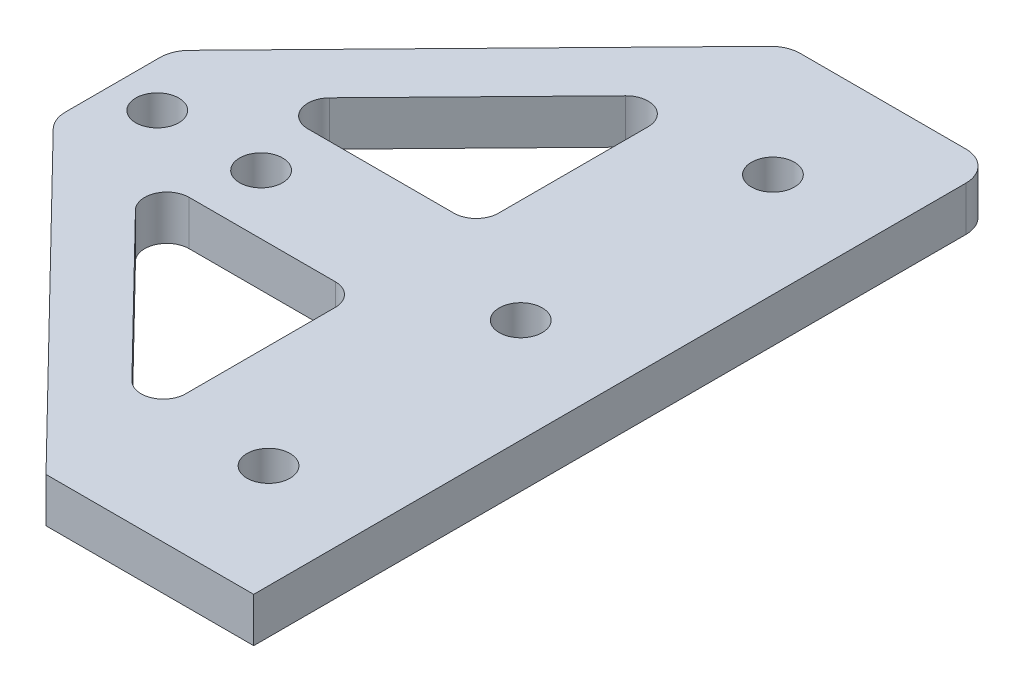
ISO-10303-21;
HEADER;
FILE_DESCRIPTION(('STEP AP214'),'2;1');
FILE_NAME('part.step','',(''),(''),'','','');
FILE_SCHEMA(('AUTOMOTIVE_DESIGN { 1 0 10303 214 1 1 1 1 }'));
ENDSEC;
DATA;
#1=APPLICATION_CONTEXT('core data for automotive mechanical design processes');
#2=APPLICATION_PROTOCOL_DEFINITION('international standard','automotive_design',2000,#1);
#3=PRODUCT_CONTEXT('',#1,'mechanical');
#4=PRODUCT('Part','Part','',(#3));
#5=PRODUCT_RELATED_PRODUCT_CATEGORY('part','',(#4));
#6=PRODUCT_DEFINITION_FORMATION('','',#4);
#7=PRODUCT_DEFINITION_CONTEXT('part definition',#1,'design');
#8=PRODUCT_DEFINITION('design','',#6,#7);
#9=PRODUCT_DEFINITION_SHAPE('','',#8);
#10=(LENGTH_UNIT() NAMED_UNIT(*) SI_UNIT(.MILLI.,.METRE.));
#11=(NAMED_UNIT(*) PLANE_ANGLE_UNIT() SI_UNIT($,.RADIAN.));
#12=(NAMED_UNIT(*) SI_UNIT($,.STERADIAN.) SOLID_ANGLE_UNIT());
#13=UNCERTAINTY_MEASURE_WITH_UNIT(LENGTH_MEASURE(1.E-05),#10,'distance_accuracy_value','');
#14=(GEOMETRIC_REPRESENTATION_CONTEXT(3) GLOBAL_UNCERTAINTY_ASSIGNED_CONTEXT((#13)) GLOBAL_UNIT_ASSIGNED_CONTEXT((#10,
#11,#12)) REPRESENTATION_CONTEXT('',''));
#15=CARTESIAN_POINT('',(0.,0.,0.));
#16=DIRECTION('',(0.,0.,1.));
#17=DIRECTION('',(1.,0.,0.));
#18=AXIS2_PLACEMENT_3D('',#15,#16,#17);
#19=CARTESIAN_POINT('',(0.,3.,0.));
#20=DIRECTION('',(-1.,0.,0.));
#21=DIRECTION('',(0.,0.,1.));
#22=AXIS2_PLACEMENT_3D('',#19,#20,#21);
#23=PLANE('',#22);
#24=DIRECTION('',(0.,0.,-1.));
#25=VECTOR('',#24,1.);
#26=CARTESIAN_POINT('',(0.,3.,0.));
#27=LINE('',#26,#25);
#28=CARTESIAN_POINT('',(0.,3.,-0.814347432356918));
#29=VERTEX_POINT('',#28);
#30=CARTESIAN_POINT('',(0.,3.,-7.18565256764308));
#31=VERTEX_POINT('',#30);
#32=EDGE_CURVE('E241',#29,#31,#27,.T.);
#33=ORIENTED_EDGE('',*,*,#32,.T.);
#34=DIRECTION('',(0.,-1.,0.));
#35=VECTOR('',#34,1.);
#36=CARTESIAN_POINT('',(0.,3.,-7.18565256764308));
#37=LINE('',#36,#35);
#38=CARTESIAN_POINT('',(0.,0.,-7.18565256764308));
#39=VERTEX_POINT('',#38);
#40=EDGE_CURVE('E53',#31,#39,#37,.T.);
#41=ORIENTED_EDGE('',*,*,#40,.T.);
#42=DIRECTION('',(0.,0.,-1.));
#43=VECTOR('',#42,1.);
#44=CARTESIAN_POINT('',(0.,0.,0.));
#45=LINE('',#44,#43);
#46=CARTESIAN_POINT('',(0.,0.,-0.814347432356918));
#47=VERTEX_POINT('',#46);
#48=EDGE_CURVE('E253',#47,#39,#45,.T.);
#49=ORIENTED_EDGE('',*,*,#48,.F.);
#50=DIRECTION('',(0.,-1.,0.));
#51=VECTOR('',#50,1.);
#52=CARTESIAN_POINT('',(0.,3.,-0.814347432356918));
#53=LINE('',#52,#51);
#54=EDGE_CURVE('E338',#47,#29,#53,.F.);
#55=ORIENTED_EDGE('',*,*,#54,.T.);
#56=EDGE_LOOP('',(#33,#41,#49,#55));
#57=FACE_BOUND('',#56,.T.);
#58=ADVANCED_FACE('F45',(#57),#23,.T.);
#59=CARTESIAN_POINT('',(0.,3.,0.));
#60=DIRECTION('',(0.,0.,-1.));
#61=DIRECTION('',(-1.,0.,0.));
#62=AXIS2_PLACEMENT_3D('',#59,#60,#61);
#63=PLANE('',#62);
#64=DIRECTION('',(1.,0.,0.));
#65=VECTOR('',#64,1.);
#66=CARTESIAN_POINT('',(0.,0.,0.));
#67=LINE('',#66,#65);
#68=CARTESIAN_POINT('',(9.15042078567245,0.,0.));
#69=VERTEX_POINT('',#68);
#70=CARTESIAN_POINT('',(19.,0.,0.));
#71=VERTEX_POINT('',#70);
#72=EDGE_CURVE('E255',#69,#71,#67,.T.);
#73=ORIENTED_EDGE('',*,*,#72,.T.);
#74=DIRECTION('',(0.,1.,0.));
#75=VECTOR('',#74,1.);
#76=CARTESIAN_POINT('',(19.,3.,0.));
#77=LINE('',#76,#75);
#78=CARTESIAN_POINT('',(19.,3.,0.));
#79=VERTEX_POINT('',#78);
#80=EDGE_CURVE('E276',#71,#79,#77,.T.);
#81=ORIENTED_EDGE('',*,*,#80,.T.);
#82=DIRECTION('',(1.,0.,0.));
#83=VECTOR('',#82,1.);
#84=CARTESIAN_POINT('',(0.,3.,0.));
#85=LINE('',#84,#83);
#86=CARTESIAN_POINT('',(9.15042078567245,3.,0.));
#87=VERTEX_POINT('',#86);
#88=EDGE_CURVE('E244',#87,#79,#85,.T.);
#89=ORIENTED_EDGE('',*,*,#88,.F.);
#90=DIRECTION('',(0.,1.,0.));
#91=VECTOR('',#90,1.);
#92=CARTESIAN_POINT('',(9.15042078567245,3.,0.));
#93=LINE('',#92,#91);
#94=EDGE_CURVE('E274',#87,#69,#93,.F.);
#95=ORIENTED_EDGE('',*,*,#94,.T.);
#96=EDGE_LOOP('',(#73,#81,#89,#95));
#97=FACE_BOUND('',#96,.T.);
#98=ADVANCED_FACE('F446',(#97),#63,.F.);
#99=CARTESIAN_POINT('',(10.,3.,-4.));
#100=DIRECTION('',(0.,-1.,0.));
#101=DIRECTION('',(0.,0.,-1.));
#102=AXIS2_PLACEMENT_3D('',#99,#100,#101);
#103=CYLINDRICAL_SURFACE('',#102,1.45);
#104=CARTESIAN_POINT('',(10.,3.,-4.));
#105=DIRECTION('',(0.,1.,0.));
#106=DIRECTION('',(0.,0.,1.));
#107=AXIS2_PLACEMENT_3D('',#104,#105,#106);
#108=CIRCLE('',#107,1.45);
#109=CARTESIAN_POINT('',(10.,3.,-2.55));
#110=VERTEX_POINT('',#109);
#111=EDGE_CURVE('E237',#110,#110,#108,.T.);
#112=ORIENTED_EDGE('',*,*,#111,.T.);
#113=EDGE_LOOP('',(#112));
#114=FACE_BOUND('',#113,.T.);
#115=CARTESIAN_POINT('',(10.,0.,-4.));
#116=DIRECTION('',(0.,1.,0.));
#117=DIRECTION('',(0.,0.,1.));
#118=AXIS2_PLACEMENT_3D('',#115,#116,#117);
#119=CIRCLE('',#118,1.45);
#120=CARTESIAN_POINT('',(10.,0.,-2.55));
#121=VERTEX_POINT('',#120);
#122=EDGE_CURVE('E226',#121,#121,#119,.T.);
#123=ORIENTED_EDGE('',*,*,#122,.F.);
#124=EDGE_LOOP('',(#123));
#125=FACE_BOUND('',#124,.T.);
#126=ADVANCED_FACE('F467',(#114,#125),#103,.F.);
#127=CARTESIAN_POINT('',(3.,3.,-4.));
#128=DIRECTION('',(0.,-1.,0.));
#129=DIRECTION('',(0.,0.,-1.));
#130=AXIS2_PLACEMENT_3D('',#127,#128,#129);
#131=CYLINDRICAL_SURFACE('',#130,1.45);
#132=CARTESIAN_POINT('',(3.,3.,-4.));
#133=DIRECTION('',(0.,1.,0.));
#134=DIRECTION('',(0.,0.,1.));
#135=AXIS2_PLACEMENT_3D('',#132,#133,#134);
#136=CIRCLE('',#135,1.45);
#137=CARTESIAN_POINT('',(3.,3.,-2.55));
#138=VERTEX_POINT('',#137);
#139=EDGE_CURVE('E234',#138,#138,#136,.T.);
#140=ORIENTED_EDGE('',*,*,#139,.T.);
#141=EDGE_LOOP('',(#140));
#142=FACE_BOUND('',#141,.T.);
#143=CARTESIAN_POINT('',(3.,0.,-4.));
#144=DIRECTION('',(0.,1.,0.));
#145=DIRECTION('',(0.,0.,1.));
#146=AXIS2_PLACEMENT_3D('',#143,#144,#145);
#147=CIRCLE('',#146,1.45);
#148=CARTESIAN_POINT('',(3.,0.,-2.55));
#149=VERTEX_POINT('',#148);
#150=EDGE_CURVE('E223',#149,#149,#147,.T.);
#151=ORIENTED_EDGE('',*,*,#150,.F.);
#152=EDGE_LOOP('',(#151));
#153=FACE_BOUND('',#152,.T.);
#154=ADVANCED_FACE('F473',(#142,#153),#131,.F.);
#155=CARTESIAN_POINT('',(0.,3.,-8.));
#156=DIRECTION('',(0.,0.,-1.));
#157=DIRECTION('',(-1.,0.,0.));
#158=AXIS2_PLACEMENT_3D('',#155,#156,#157);
#159=PLANE('',#158);
#160=DIRECTION('',(1.,0.,0.));
#161=VECTOR('',#160,1.);
#162=CARTESIAN_POINT('',(0.,3.,-8.));
#163=LINE('',#162,#161);
#164=CARTESIAN_POINT('',(9.15042078567246,3.,-8.));
#165=VERTEX_POINT('',#164);
#166=CARTESIAN_POINT('',(19.,3.,-8.));
#167=VERTEX_POINT('',#166);
#168=EDGE_CURVE('E247',#165,#167,#163,.T.);
#169=ORIENTED_EDGE('',*,*,#168,.T.);
#170=DIRECTION('',(0.,1.,0.));
#171=VECTOR('',#170,1.);
#172=CARTESIAN_POINT('',(19.,0.,-8.));
#173=LINE('',#172,#171);
#174=CARTESIAN_POINT('',(19.,0.,-8.));
#175=VERTEX_POINT('',#174);
#176=EDGE_CURVE('E272',#167,#175,#173,.F.);
#177=ORIENTED_EDGE('',*,*,#176,.T.);
#178=DIRECTION('',(1.,0.,0.));
#179=VECTOR('',#178,1.);
#180=CARTESIAN_POINT('',(0.,0.,-8.));
#181=LINE('',#180,#179);
#182=CARTESIAN_POINT('',(9.15042078567246,0.,-8.));
#183=VERTEX_POINT('',#182);
#184=EDGE_CURVE('E238',#183,#175,#181,.T.);
#185=ORIENTED_EDGE('',*,*,#184,.F.);
#186=DIRECTION('',(0.,1.,0.));
#187=VECTOR('',#186,1.);
#188=CARTESIAN_POINT('',(9.15042078567246,3.,-8.));
#189=LINE('',#188,#187);
#190=EDGE_CURVE('E269',#183,#165,#189,.T.);
#191=ORIENTED_EDGE('',*,*,#190,.T.);
#192=EDGE_LOOP('',(#169,#177,#185,#191));
#193=FACE_BOUND('',#192,.T.);
#194=ADVANCED_FACE('F477',(#193),#159,.T.);
#195=CARTESIAN_POINT('',(0.,3.,0.));
#196=DIRECTION('',(0.,1.,0.));
#197=DIRECTION('',(0.,0.,1.));
#198=AXIS2_PLACEMENT_3D('',#195,#196,#197);
#199=PLANE('',#198);
#200=ORIENTED_EDGE('',*,*,#168,.F.);
#201=CARTESIAN_POINT('',(9.15042078567246,3.,-9.5));
#202=DIRECTION('',(0.,1.,0.));
#203=DIRECTION('',(0.,0.,1.));
#204=AXIS2_PLACEMENT_3D('',#201,#202,#203);
#205=CIRCLE('',#204,1.5);
#206=CARTESIAN_POINT('',(8.07705947685128,3.,-10.5478050871826));
#207=VERTEX_POINT('',#206);
#208=EDGE_CURVE('E309',#165,#207,#205,.F.);
#209=ORIENTED_EDGE('',*,*,#208,.T.);
#210=DIRECTION('',(0.698536724788386,0.,-0.715574205880784));
#211=VECTOR('',#210,1.);
#212=CARTESIAN_POINT('',(20.5,3.,-23.2737441596764));
#213=LINE('',#212,#211);
#214=CARTESIAN_POINT('',(17.9266386911789,3.,-20.637617940884));
#215=VERTEX_POINT('',#214);
#216=EDGE_CURVE('E418',#207,#215,#213,.T.);
#217=ORIENTED_EDGE('',*,*,#216,.T.);
#218=CARTESIAN_POINT('',(19.0000000000001,3.,-19.5898128537014));
#219=DIRECTION('',(0.,1.,0.));
#220=DIRECTION('',(0.,0.,1.));
#221=AXIS2_PLACEMENT_3D('',#218,#219,#220);
#222=CIRCLE('',#221,1.5);
#223=CARTESIAN_POINT('',(20.5000000000001,3.,-19.5898128537014));
#224=VERTEX_POINT('',#223);
#225=EDGE_CURVE('E289',#215,#224,#222,.F.);
#226=ORIENTED_EDGE('',*,*,#225,.T.);
#227=DIRECTION('',(0.,0.,1.));
#228=VECTOR('',#227,1.);
#229=CARTESIAN_POINT('',(20.4999999999999,3.,21.));
#230=LINE('',#229,#228);
#231=CARTESIAN_POINT('',(20.5,3.,-9.49999999999999));
#232=VERTEX_POINT('',#231);
#233=EDGE_CURVE('E374',#224,#232,#230,.T.);
#234=ORIENTED_EDGE('',*,*,#233,.T.);
#235=CARTESIAN_POINT('',(19.,3.,-9.5));
#236=DIRECTION('',(0.,1.,0.));
#237=DIRECTION('',(0.,0.,1.));
#238=AXIS2_PLACEMENT_3D('',#235,#236,#237);
#239=CIRCLE('',#238,1.5);
#240=EDGE_CURVE('E293',#232,#167,#239,.F.);
#241=ORIENTED_EDGE('',*,*,#240,.T.);
#242=EDGE_LOOP('',(#200,#209,#217,#226,#234,#241));
#243=FACE_BOUND('',#242,.T.);
#244=CARTESIAN_POINT('',(20.5,3.,1.5));
#245=VERTEX_POINT('',#244);
#246=CARTESIAN_POINT('',(20.5,3.,11.5898128537013));
#247=VERTEX_POINT('',#246);
#248=EDGE_CURVE('E231',#245,#247,#230,.T.);
#249=ORIENTED_EDGE('',*,*,#248,.T.);
#250=CARTESIAN_POINT('',(19.,3.,11.5898128537013));
#251=DIRECTION('',(0.,1.,0.));
#252=DIRECTION('',(0.,0.,1.));
#253=AXIS2_PLACEMENT_3D('',#250,#251,#252);
#254=CIRCLE('',#253,1.5);
#255=CARTESIAN_POINT('',(17.9266386911788,3.,12.6376179408839));
#256=VERTEX_POINT('',#255);
#257=EDGE_CURVE('E301',#247,#256,#254,.F.);
#258=ORIENTED_EDGE('',*,*,#257,.T.);
#259=DIRECTION('',(-0.698536724788386,0.,-0.715574205880784));
#260=VECTOR('',#259,1.);
#261=CARTESIAN_POINT('',(5.58991641555399,3.,0.));
#262=LINE('',#261,#260);
#263=CARTESIAN_POINT('',(8.07705947685128,3.,2.54780508718258));
#264=VERTEX_POINT('',#263);
#265=EDGE_CURVE('E206',#256,#264,#262,.T.);
#266=ORIENTED_EDGE('',*,*,#265,.T.);
#267=CARTESIAN_POINT('',(9.15042078567245,3.,1.5));
#268=DIRECTION('',(0.,1.,0.));
#269=DIRECTION('',(0.,0.,1.));
#270=AXIS2_PLACEMENT_3D('',#267,#268,#269);
#271=CIRCLE('',#270,1.5);
#272=EDGE_CURVE('E305',#264,#87,#271,.F.);
#273=ORIENTED_EDGE('',*,*,#272,.T.);
#274=ORIENTED_EDGE('',*,*,#88,.T.);
#275=CARTESIAN_POINT('',(19.,3.,1.5));
#276=DIRECTION('',(0.,1.,0.));
#277=DIRECTION('',(0.,0.,1.));
#278=AXIS2_PLACEMENT_3D('',#275,#276,#277);
#279=CIRCLE('',#278,1.5);
#280=EDGE_CURVE('E297',#79,#245,#279,.F.);
#281=ORIENTED_EDGE('',*,*,#280,.T.);
#282=EDGE_LOOP('',(#249,#258,#266,#273,#274,#281));
#283=FACE_BOUND('',#282,.T.);
#284=CARTESIAN_POINT('',(27.5000000000001,3.,-21.));
#285=DIRECTION('',(0.,1.,0.));
#286=DIRECTION('',(0.,0.,1.));
#287=AXIS2_PLACEMENT_3D('',#284,#285,#286);
#288=CIRCLE('',#287,1.45);
#289=CARTESIAN_POINT('',(27.5000000000001,3.,-19.55));
#290=VERTEX_POINT('',#289);
#291=EDGE_CURVE('E356',#290,#290,#288,.T.);
#292=ORIENTED_EDGE('',*,*,#291,.F.);
#293=EDGE_LOOP('',(#292));
#294=FACE_BOUND('',#293,.T.);
#295=CARTESIAN_POINT('',(27.5,3.,-4.00000000000001));
#296=DIRECTION('',(0.,1.,0.));
#297=DIRECTION('',(0.,0.,1.));
#298=AXIS2_PLACEMENT_3D('',#295,#296,#297);
#299=CIRCLE('',#298,1.45);
#300=CARTESIAN_POINT('',(27.5,3.,-2.55000000000001));
#301=VERTEX_POINT('',#300);
#302=EDGE_CURVE('E359',#301,#301,#299,.T.);
#303=ORIENTED_EDGE('',*,*,#302,.F.);
#304=EDGE_LOOP('',(#303));
#305=FACE_BOUND('',#304,.T.);
#306=CARTESIAN_POINT('',(27.4999999999999,3.,13.));
#307=DIRECTION('',(0.,1.,0.));
#308=DIRECTION('',(0.,0.,1.));
#309=AXIS2_PLACEMENT_3D('',#306,#307,#308);
#310=CIRCLE('',#309,1.45);
#311=CARTESIAN_POINT('',(27.4999999999999,3.,14.45));
#312=VERTEX_POINT('',#311);
#313=EDGE_CURVE('E365',#312,#312,#310,.T.);
#314=ORIENTED_EDGE('',*,*,#313,.F.);
#315=EDGE_LOOP('',(#314));
#316=FACE_BOUND('',#315,.T.);
#317=DIRECTION('',(0.,0.,-1.));
#318=VECTOR('',#317,1.);
#319=CARTESIAN_POINT('',(34.4999999999999,3.,21.));
#320=LINE('',#319,#318);
#321=CARTESIAN_POINT('',(34.4999999999999,3.,21.));
#322=VERTEX_POINT('',#321);
#323=CARTESIAN_POINT('',(34.5000000000001,3.,-27.));
#324=VERTEX_POINT('',#323);
#325=EDGE_CURVE('E217',#322,#324,#320,.T.);
#326=ORIENTED_EDGE('',*,*,#325,.T.);
#327=CARTESIAN_POINT('',(32.5000000000001,3.,-27.));
#328=DIRECTION('',(0.,1.,0.));
#329=DIRECTION('',(0.,0.,1.));
#330=AXIS2_PLACEMENT_3D('',#327,#328,#329);
#331=CIRCLE('',#330,2.);
#332=CARTESIAN_POINT('',(32.5000000000001,3.,-29.));
#333=VERTEX_POINT('',#332);
#334=EDGE_CURVE('E321',#324,#333,#331,.T.);
#335=ORIENTED_EDGE('',*,*,#334,.T.);
#336=DIRECTION('',(-1.,0.,0.));
#337=VECTOR('',#336,1.);
#338=CARTESIAN_POINT('',(20.5000000000001,3.,-29.));
#339=LINE('',#338,#337);
#340=CARTESIAN_POINT('',(21.3425772553961,3.,-29.));
#341=VERTEX_POINT('',#340);
#342=EDGE_CURVE('E383',#333,#341,#339,.T.);
#343=ORIENTED_EDGE('',*,*,#342,.T.);
#344=CARTESIAN_POINT('',(21.3425772553961,3.,-27.));
#345=DIRECTION('',(0.,1.,0.));
#346=DIRECTION('',(0.,0.,1.));
#347=AXIS2_PLACEMENT_3D('',#344,#345,#346);
#348=CIRCLE('',#347,2.);
#349=CARTESIAN_POINT('',(19.9114288436345,3.,-28.3970734495768));
#350=VERTEX_POINT('',#349);
#351=EDGE_CURVE('E319',#341,#350,#348,.T.);
#352=ORIENTED_EDGE('',*,*,#351,.T.);
#353=DIRECTION('',(-0.698536724788386,0.,0.715574205880784));
#354=VECTOR('',#353,1.);
#355=CARTESIAN_POINT('',(0.,3.,-8.));
#356=LINE('',#355,#354);
#357=CARTESIAN_POINT('',(0.568851588238433,3.,-8.58272601721986));
#358=VERTEX_POINT('',#357);
#359=EDGE_CURVE('E414',#350,#358,#356,.T.);
#360=ORIENTED_EDGE('',*,*,#359,.T.);
#361=CARTESIAN_POINT('',(2.,3.,-7.18565256764308));
#362=DIRECTION('',(0.,1.,0.));
#363=DIRECTION('',(0.,0.,1.));
#364=AXIS2_PLACEMENT_3D('',#361,#362,#363);
#365=CIRCLE('',#364,2.);
#366=EDGE_CURVE('E317',#358,#31,#365,.T.);
#367=ORIENTED_EDGE('',*,*,#366,.T.);
#368=ORIENTED_EDGE('',*,*,#32,.F.);
#369=CARTESIAN_POINT('',(2.,3.,-0.814347432356918));
#370=DIRECTION('',(0.,1.,0.));
#371=DIRECTION('',(0.,0.,1.));
#372=AXIS2_PLACEMENT_3D('',#369,#370,#371);
#373=CIRCLE('',#372,2.);
#374=CARTESIAN_POINT('',(0.568851588238429,3.,0.582726017219849));
#375=VERTEX_POINT('',#374);
#376=EDGE_CURVE('E203',#29,#375,#373,.T.);
#377=ORIENTED_EDGE('',*,*,#376,.T.);
#378=DIRECTION('',(0.698536724788386,0.,0.715574205880784));
#379=VECTOR('',#378,1.);
#380=CARTESIAN_POINT('',(20.5,3.,21.));
#381=LINE('',#380,#379);
#382=CARTESIAN_POINT('',(20.5,3.,21.));
#383=VERTEX_POINT('',#382);
#384=EDGE_CURVE('E195',#375,#383,#381,.T.);
#385=ORIENTED_EDGE('',*,*,#384,.T.);
#386=DIRECTION('',(1.,0.,0.));
#387=VECTOR('',#386,1.);
#388=CARTESIAN_POINT('',(20.4999999999999,3.,21.));
#389=LINE('',#388,#387);
#390=EDGE_CURVE('E200',#383,#322,#389,.T.);
#391=ORIENTED_EDGE('',*,*,#390,.T.);
#392=EDGE_LOOP('',(#326,#335,#343,#352,#360,#367,#368,#377,#385,#391));
#393=FACE_BOUND('',#392,.T.);
#394=ORIENTED_EDGE('',*,*,#139,.F.);
#395=EDGE_LOOP('',(#394));
#396=FACE_BOUND('',#395,.T.);
#397=ORIENTED_EDGE('',*,*,#111,.F.);
#398=EDGE_LOOP('',(#397));
#399=FACE_BOUND('',#398,.T.);
#400=ADVANCED_FACE('F198',(#243,#283,#294,#305,#316,#393,#396,#399),#199,.T.);
#401=CARTESIAN_POINT('',(0.,0.,0.));
#402=DIRECTION('',(0.,1.,0.));
#403=DIRECTION('',(0.,0.,1.));
#404=AXIS2_PLACEMENT_3D('',#401,#402,#403);
#405=PLANE('',#404);
#406=DIRECTION('',(0.698536724788386,0.,-0.715574205880784));
#407=VECTOR('',#406,1.);
#408=CARTESIAN_POINT('',(20.5,0.,-23.2737441596764));
#409=LINE('',#408,#407);
#410=CARTESIAN_POINT('',(8.07705947685128,0.,-10.5478050871826));
#411=VERTEX_POINT('',#410);
#412=CARTESIAN_POINT('',(17.9266386911789,0.,-20.637617940884));
#413=VERTEX_POINT('',#412);
#414=EDGE_CURVE('E408',#411,#413,#409,.T.);
#415=ORIENTED_EDGE('',*,*,#414,.F.);
#416=CARTESIAN_POINT('',(9.15042078567246,0.,-9.5));
#417=DIRECTION('',(0.,1.,0.));
#418=DIRECTION('',(0.,0.,1.));
#419=AXIS2_PLACEMENT_3D('',#416,#417,#418);
#420=CIRCLE('',#419,1.5);
#421=EDGE_CURVE('E311',#411,#183,#420,.T.);
#422=ORIENTED_EDGE('',*,*,#421,.T.);
#423=ORIENTED_EDGE('',*,*,#184,.T.);
#424=CARTESIAN_POINT('',(19.,0.,-9.5));
#425=DIRECTION('',(0.,1.,0.));
#426=DIRECTION('',(0.,0.,1.));
#427=AXIS2_PLACEMENT_3D('',#424,#425,#426);
#428=CIRCLE('',#427,1.5);
#429=CARTESIAN_POINT('',(20.5,0.,-9.49999999999999));
#430=VERTEX_POINT('',#429);
#431=EDGE_CURVE('E295',#175,#430,#428,.T.);
#432=ORIENTED_EDGE('',*,*,#431,.T.);
#433=DIRECTION('',(0.,0.,1.));
#434=VECTOR('',#433,1.);
#435=CARTESIAN_POINT('',(20.4999999999999,0.,21.));
#436=LINE('',#435,#434);
#437=CARTESIAN_POINT('',(20.5000000000001,0.,-19.5898128537014));
#438=VERTEX_POINT('',#437);
#439=EDGE_CURVE('E228',#438,#430,#436,.T.);
#440=ORIENTED_EDGE('',*,*,#439,.F.);
#441=CARTESIAN_POINT('',(19.0000000000001,0.,-19.5898128537014));
#442=DIRECTION('',(0.,1.,0.));
#443=DIRECTION('',(0.,0.,1.));
#444=AXIS2_PLACEMENT_3D('',#441,#442,#443);
#445=CIRCLE('',#444,1.5);
#446=EDGE_CURVE('E291',#438,#413,#445,.T.);
#447=ORIENTED_EDGE('',*,*,#446,.T.);
#448=EDGE_LOOP('',(#415,#422,#423,#432,#440,#447));
#449=FACE_BOUND('',#448,.T.);
#450=ORIENTED_EDGE('',*,*,#72,.F.);
#451=CARTESIAN_POINT('',(9.15042078567245,0.,1.5));
#452=DIRECTION('',(0.,1.,0.));
#453=DIRECTION('',(0.,0.,1.));
#454=AXIS2_PLACEMENT_3D('',#451,#452,#453);
#455=CIRCLE('',#454,1.5);
#456=CARTESIAN_POINT('',(8.07705947685128,0.,2.54780508718258));
#457=VERTEX_POINT('',#456);
#458=EDGE_CURVE('E307',#69,#457,#455,.T.);
#459=ORIENTED_EDGE('',*,*,#458,.T.);
#460=DIRECTION('',(-0.698536724788386,0.,-0.715574205880784));
#461=VECTOR('',#460,1.);
#462=CARTESIAN_POINT('',(5.58991641555399,0.,0.));
#463=LINE('',#462,#461);
#464=CARTESIAN_POINT('',(17.9266386911788,0.,12.6376179408839));
#465=VERTEX_POINT('',#464);
#466=EDGE_CURVE('E207',#465,#457,#463,.T.);
#467=ORIENTED_EDGE('',*,*,#466,.F.);
#468=CARTESIAN_POINT('',(19.,0.,11.5898128537013));
#469=DIRECTION('',(0.,1.,0.));
#470=DIRECTION('',(0.,0.,1.));
#471=AXIS2_PLACEMENT_3D('',#468,#469,#470);
#472=CIRCLE('',#471,1.5);
#473=CARTESIAN_POINT('',(20.5,0.,11.5898128537013));
#474=VERTEX_POINT('',#473);
#475=EDGE_CURVE('E303',#465,#474,#472,.T.);
#476=ORIENTED_EDGE('',*,*,#475,.T.);
#477=CARTESIAN_POINT('',(20.5,0.,1.5));
#478=VERTEX_POINT('',#477);
#479=EDGE_CURVE('E380',#478,#474,#436,.T.);
#480=ORIENTED_EDGE('',*,*,#479,.F.);
#481=CARTESIAN_POINT('',(19.,0.,1.5));
#482=DIRECTION('',(0.,1.,0.));
#483=DIRECTION('',(0.,0.,1.));
#484=AXIS2_PLACEMENT_3D('',#481,#482,#483);
#485=CIRCLE('',#484,1.5);
#486=EDGE_CURVE('E299',#478,#71,#485,.T.);
#487=ORIENTED_EDGE('',*,*,#486,.T.);
#488=EDGE_LOOP('',(#450,#459,#467,#476,#480,#487));
#489=FACE_BOUND('',#488,.T.);
#490=CARTESIAN_POINT('',(27.5000000000001,0.,-21.));
#491=DIRECTION('',(0.,1.,0.));
#492=DIRECTION('',(0.,0.,1.));
#493=AXIS2_PLACEMENT_3D('',#490,#491,#492);
#494=CIRCLE('',#493,1.45);
#495=CARTESIAN_POINT('',(27.5000000000001,0.,-19.55));
#496=VERTEX_POINT('',#495);
#497=EDGE_CURVE('E218',#496,#496,#494,.T.);
#498=ORIENTED_EDGE('',*,*,#497,.T.);
#499=EDGE_LOOP('',(#498));
#500=FACE_BOUND('',#499,.T.);
#501=CARTESIAN_POINT('',(27.5,0.,-4.00000000000001));
#502=DIRECTION('',(0.,1.,0.));
#503=DIRECTION('',(0.,0.,1.));
#504=AXIS2_PLACEMENT_3D('',#501,#502,#503);
#505=CIRCLE('',#504,1.45);
#506=CARTESIAN_POINT('',(27.5,0.,-2.55000000000001));
#507=VERTEX_POINT('',#506);
#508=EDGE_CURVE('E362',#507,#507,#505,.T.);
#509=ORIENTED_EDGE('',*,*,#508,.T.);
#510=EDGE_LOOP('',(#509));
#511=FACE_BOUND('',#510,.T.);
#512=CARTESIAN_POINT('',(27.4999999999999,0.,13.));
#513=DIRECTION('',(0.,1.,0.));
#514=DIRECTION('',(0.,0.,1.));
#515=AXIS2_PLACEMENT_3D('',#512,#513,#514);
#516=CIRCLE('',#515,1.45);
#517=CARTESIAN_POINT('',(27.4999999999999,0.,14.45));
#518=VERTEX_POINT('',#517);
#519=EDGE_CURVE('E368',#518,#518,#516,.T.);
#520=ORIENTED_EDGE('',*,*,#519,.T.);
#521=EDGE_LOOP('',(#520));
#522=FACE_BOUND('',#521,.T.);
#523=ORIENTED_EDGE('',*,*,#150,.T.);
#524=EDGE_LOOP('',(#523));
#525=FACE_BOUND('',#524,.T.);
#526=ORIENTED_EDGE('',*,*,#122,.T.);
#527=EDGE_LOOP('',(#526));
#528=FACE_BOUND('',#527,.T.);
#529=DIRECTION('',(-1.,0.,0.));
#530=VECTOR('',#529,1.);
#531=CARTESIAN_POINT('',(20.5000000000001,0.,-29.));
#532=LINE('',#531,#530);
#533=CARTESIAN_POINT('',(32.5000000000001,0.,-29.));
#534=VERTEX_POINT('',#533);
#535=CARTESIAN_POINT('',(21.3425772553961,0.,-29.));
#536=VERTEX_POINT('',#535);
#537=EDGE_CURVE('E377',#534,#536,#532,.T.);
#538=ORIENTED_EDGE('',*,*,#537,.F.);
#539=CARTESIAN_POINT('',(32.5000000000001,0.,-27.));
#540=DIRECTION('',(0.,1.,0.));
#541=DIRECTION('',(0.,0.,1.));
#542=AXIS2_PLACEMENT_3D('',#539,#540,#541);
#543=CIRCLE('',#542,2.);
#544=CARTESIAN_POINT('',(34.5000000000001,0.,-27.));
#545=VERTEX_POINT('',#544);
#546=EDGE_CURVE('E332',#534,#545,#543,.F.);
#547=ORIENTED_EDGE('',*,*,#546,.T.);
#548=DIRECTION('',(0.,0.,-1.));
#549=VECTOR('',#548,1.);
#550=CARTESIAN_POINT('',(34.4999999999999,0.,21.));
#551=LINE('',#550,#549);
#552=CARTESIAN_POINT('',(34.4999999999999,0.,21.));
#553=VERTEX_POINT('',#552);
#554=EDGE_CURVE('E373',#553,#545,#551,.T.);
#555=ORIENTED_EDGE('',*,*,#554,.F.);
#556=DIRECTION('',(1.,0.,0.));
#557=VECTOR('',#556,1.);
#558=CARTESIAN_POINT('',(20.4999999999999,0.,21.));
#559=LINE('',#558,#557);
#560=CARTESIAN_POINT('',(20.4999999999999,0.,21.));
#561=VERTEX_POINT('',#560);
#562=EDGE_CURVE('E348',#561,#553,#559,.T.);
#563=ORIENTED_EDGE('',*,*,#562,.F.);
#564=DIRECTION('',(0.698536724788386,0.,0.715574205880784));
#565=VECTOR('',#564,1.);
#566=CARTESIAN_POINT('',(20.5,0.,21.));
#567=LINE('',#566,#565);
#568=CARTESIAN_POINT('',(0.568851588238429,0.,0.582726017219849));
#569=VERTEX_POINT('',#568);
#570=EDGE_CURVE('E222',#569,#561,#567,.T.);
#571=ORIENTED_EDGE('',*,*,#570,.F.);
#572=CARTESIAN_POINT('',(2.,0.,-0.814347432356918));
#573=DIRECTION('',(0.,1.,0.));
#574=DIRECTION('',(0.,0.,1.));
#575=AXIS2_PLACEMENT_3D('',#572,#573,#574);
#576=CIRCLE('',#575,2.);
#577=EDGE_CURVE('E60',#569,#47,#576,.F.);
#578=ORIENTED_EDGE('',*,*,#577,.T.);
#579=ORIENTED_EDGE('',*,*,#48,.T.);
#580=CARTESIAN_POINT('',(2.,0.,-7.18565256764308));
#581=DIRECTION('',(0.,1.,0.));
#582=DIRECTION('',(0.,0.,1.));
#583=AXIS2_PLACEMENT_3D('',#580,#581,#582);
#584=CIRCLE('',#583,2.);
#585=CARTESIAN_POINT('',(0.568851588238433,0.,-8.58272601721986));
#586=VERTEX_POINT('',#585);
#587=EDGE_CURVE('E67',#39,#586,#584,.F.);
#588=ORIENTED_EDGE('',*,*,#587,.T.);
#589=DIRECTION('',(-0.698536724788386,0.,0.715574205880784));
#590=VECTOR('',#589,1.);
#591=CARTESIAN_POINT('',(0.,0.,-8.));
#592=LINE('',#591,#590);
#593=CARTESIAN_POINT('',(19.9114288436345,0.,-28.3970734495768));
#594=VERTEX_POINT('',#593);
#595=EDGE_CURVE('E371',#594,#586,#592,.T.);
#596=ORIENTED_EDGE('',*,*,#595,.F.);
#597=CARTESIAN_POINT('',(21.3425772553961,0.,-27.));
#598=DIRECTION('',(0.,1.,0.));
#599=DIRECTION('',(0.,0.,1.));
#600=AXIS2_PLACEMENT_3D('',#597,#598,#599);
#601=CIRCLE('',#600,2.);
#602=EDGE_CURVE('E330',#594,#536,#601,.F.);
#603=ORIENTED_EDGE('',*,*,#602,.T.);
#604=EDGE_LOOP('',(#538,#547,#555,#563,#571,#578,#579,#588,#596,#603));
#605=FACE_BOUND('',#604,.T.);
#606=ADVANCED_FACE('F346',(#449,#489,#500,#511,#522,#525,#528,#605),#405,.F.);
#607=CARTESIAN_POINT('',(20.4999999999999,0.,21.));
#608=DIRECTION('',(-1.,0.,0.));
#609=DIRECTION('',(0.,0.,1.));
#610=AXIS2_PLACEMENT_3D('',#607,#608,#609);
#611=PLANE('',#610);
#612=ORIENTED_EDGE('',*,*,#248,.F.);
#613=DIRECTION('',(0.,1.,0.));
#614=VECTOR('',#613,1.);
#615=CARTESIAN_POINT('',(20.5,0.,1.5));
#616=LINE('',#615,#614);
#617=EDGE_CURVE('E282',#245,#478,#616,.F.);
#618=ORIENTED_EDGE('',*,*,#617,.T.);
#619=ORIENTED_EDGE('',*,*,#479,.T.);
#620=DIRECTION('',(0.,1.,0.));
#621=VECTOR('',#620,1.);
#622=CARTESIAN_POINT('',(20.5,3.,11.5898128537013));
#623=LINE('',#622,#621);
#624=EDGE_CURVE('E279',#474,#247,#623,.T.);
#625=ORIENTED_EDGE('',*,*,#624,.T.);
#626=EDGE_LOOP('',(#612,#618,#619,#625));
#627=FACE_BOUND('',#626,.T.);
#628=ADVANCED_FACE('F439',(#627),#611,.T.);
#629=CARTESIAN_POINT('',(20.4999999999999,0.,21.));
#630=DIRECTION('',(0.,0.,1.));
#631=DIRECTION('',(1.,0.,0.));
#632=AXIS2_PLACEMENT_3D('',#629,#630,#631);
#633=PLANE('',#632);
#634=ORIENTED_EDGE('',*,*,#390,.F.);
#635=DIRECTION('',(0.,1.,0.));
#636=VECTOR('',#635,1.);
#637=CARTESIAN_POINT('',(20.4999999999999,0.,21.));
#638=LINE('',#637,#636);
#639=EDGE_CURVE('E213',#561,#383,#638,.T.);
#640=ORIENTED_EDGE('',*,*,#639,.F.);
#641=ORIENTED_EDGE('',*,*,#562,.T.);
#642=DIRECTION('',(0.,1.,0.));
#643=VECTOR('',#642,1.);
#644=CARTESIAN_POINT('',(34.4999999999999,0.,21.));
#645=LINE('',#644,#643);
#646=EDGE_CURVE('E215',#553,#322,#645,.T.);
#647=ORIENTED_EDGE('',*,*,#646,.T.);
#648=EDGE_LOOP('',(#634,#640,#641,#647));
#649=FACE_BOUND('',#648,.T.);
#650=ADVANCED_FACE('F211',(#649),#633,.T.);
#651=ORIENTED_EDGE('',*,*,#233,.F.);
#652=DIRECTION('',(0.,1.,0.));
#653=VECTOR('',#652,1.);
#654=CARTESIAN_POINT('',(20.5000000000001,0.,-19.5898128537014));
#655=LINE('',#654,#653);
#656=EDGE_CURVE('E267',#224,#438,#655,.F.);
#657=ORIENTED_EDGE('',*,*,#656,.T.);
#658=ORIENTED_EDGE('',*,*,#439,.T.);
#659=DIRECTION('',(0.,1.,0.));
#660=VECTOR('',#659,1.);
#661=CARTESIAN_POINT('',(20.5,3.,-9.49999999999999));
#662=LINE('',#661,#660);
#663=EDGE_CURVE('E264',#430,#232,#662,.T.);
#664=ORIENTED_EDGE('',*,*,#663,.T.);
#665=EDGE_LOOP('',(#651,#657,#658,#664));
#666=FACE_BOUND('',#665,.T.);
#667=ADVANCED_FACE('F396',(#666),#611,.T.);
#668=CARTESIAN_POINT('',(20.5000000000001,0.,-29.));
#669=DIRECTION('',(0.,0.,-1.));
#670=DIRECTION('',(-1.,0.,0.));
#671=AXIS2_PLACEMENT_3D('',#668,#669,#670);
#672=PLANE('',#671);
#673=ORIENTED_EDGE('',*,*,#342,.F.);
#674=DIRECTION('',(0.,1.,0.));
#675=VECTOR('',#674,1.);
#676=CARTESIAN_POINT('',(32.5000000000001,0.,-29.));
#677=LINE('',#676,#675);
#678=EDGE_CURVE('E326',#333,#534,#677,.F.);
#679=ORIENTED_EDGE('',*,*,#678,.T.);
#680=ORIENTED_EDGE('',*,*,#537,.T.);
#681=DIRECTION('',(0.,1.,0.));
#682=VECTOR('',#681,1.);
#683=CARTESIAN_POINT('',(21.3425772553961,0.,-29.));
#684=LINE('',#683,#682);
#685=EDGE_CURVE('E323',#536,#341,#684,.T.);
#686=ORIENTED_EDGE('',*,*,#685,.T.);
#687=EDGE_LOOP('',(#673,#679,#680,#686));
#688=FACE_BOUND('',#687,.T.);
#689=ADVANCED_FACE('F552',(#688),#672,.T.);
#690=CARTESIAN_POINT('',(34.4999999999999,0.,21.));
#691=DIRECTION('',(1.,0.,0.));
#692=DIRECTION('',(0.,0.,-1.));
#693=AXIS2_PLACEMENT_3D('',#690,#691,#692);
#694=PLANE('',#693);
#695=ORIENTED_EDGE('',*,*,#554,.T.);
#696=DIRECTION('',(0.,1.,0.));
#697=VECTOR('',#696,1.);
#698=CARTESIAN_POINT('',(34.5000000000001,0.,-27.));
#699=LINE('',#698,#697);
#700=EDGE_CURVE('E313',#545,#324,#699,.T.);
#701=ORIENTED_EDGE('',*,*,#700,.T.);
#702=ORIENTED_EDGE('',*,*,#325,.F.);
#703=ORIENTED_EDGE('',*,*,#646,.F.);
#704=EDGE_LOOP('',(#695,#701,#702,#703));
#705=FACE_BOUND('',#704,.T.);
#706=ADVANCED_FACE('F557',(#705),#694,.T.);
#707=CARTESIAN_POINT('',(27.4999999999999,0.,13.));
#708=DIRECTION('',(0.,1.,0.));
#709=DIRECTION('',(0.,0.,1.));
#710=AXIS2_PLACEMENT_3D('',#707,#708,#709);
#711=CYLINDRICAL_SURFACE('',#710,1.45);
#712=ORIENTED_EDGE('',*,*,#519,.F.);
#713=EDGE_LOOP('',(#712));
#714=FACE_BOUND('',#713,.T.);
#715=ORIENTED_EDGE('',*,*,#313,.T.);
#716=EDGE_LOOP('',(#715));
#717=FACE_BOUND('',#716,.T.);
#718=ADVANCED_FACE('F559',(#714,#717),#711,.F.);
#719=CARTESIAN_POINT('',(27.5,0.,-4.00000000000001));
#720=DIRECTION('',(0.,1.,0.));
#721=DIRECTION('',(0.,0.,1.));
#722=AXIS2_PLACEMENT_3D('',#719,#720,#721);
#723=CYLINDRICAL_SURFACE('',#722,1.45);
#724=ORIENTED_EDGE('',*,*,#508,.F.);
#725=EDGE_LOOP('',(#724));
#726=FACE_BOUND('',#725,.T.);
#727=ORIENTED_EDGE('',*,*,#302,.T.);
#728=EDGE_LOOP('',(#727));
#729=FACE_BOUND('',#728,.T.);
#730=ADVANCED_FACE('F566',(#726,#729),#723,.F.);
#731=CARTESIAN_POINT('',(27.5000000000001,0.,-21.));
#732=DIRECTION('',(0.,1.,0.));
#733=DIRECTION('',(0.,0.,1.));
#734=AXIS2_PLACEMENT_3D('',#731,#732,#733);
#735=CYLINDRICAL_SURFACE('',#734,1.45);
#736=ORIENTED_EDGE('',*,*,#497,.F.);
#737=EDGE_LOOP('',(#736));
#738=FACE_BOUND('',#737,.T.);
#739=ORIENTED_EDGE('',*,*,#291,.T.);
#740=EDGE_LOOP('',(#739));
#741=FACE_BOUND('',#740,.T.);
#742=ADVANCED_FACE('F643',(#738,#741),#735,.F.);
#743=CARTESIAN_POINT('',(0.,0.,-8.));
#744=DIRECTION('',(-0.715574205880784,0.,-0.698536724788386));
#745=DIRECTION('',(-0.698536724788386,0.,0.715574205880784));
#746=AXIS2_PLACEMENT_3D('',#743,#744,#745);
#747=PLANE('',#746);
#748=ORIENTED_EDGE('',*,*,#359,.F.);
#749=DIRECTION('',(0.,1.,0.));
#750=VECTOR('',#749,1.);
#751=CARTESIAN_POINT('',(19.9114288436345,0.,-28.3970734495768));
#752=LINE('',#751,#750);
#753=EDGE_CURVE('E336',#350,#594,#752,.F.);
#754=ORIENTED_EDGE('',*,*,#753,.T.);
#755=ORIENTED_EDGE('',*,*,#595,.T.);
#756=DIRECTION('',(0.,-1.,0.));
#757=VECTOR('',#756,1.);
#758=CARTESIAN_POINT('',(0.568851588238433,0.,-8.58272601721986));
#759=LINE('',#758,#757);
#760=EDGE_CURVE('E334',#586,#358,#759,.F.);
#761=ORIENTED_EDGE('',*,*,#760,.T.);
#762=EDGE_LOOP('',(#748,#754,#755,#761));
#763=FACE_BOUND('',#762,.T.);
#764=ADVANCED_FACE('F547',(#763),#747,.T.);
#765=CARTESIAN_POINT('',(20.5,0.,-23.2737441596764));
#766=DIRECTION('',(0.715574205880784,0.,0.698536724788386));
#767=DIRECTION('',(0.698536724788386,0.,-0.715574205880784));
#768=AXIS2_PLACEMENT_3D('',#765,#766,#767);
#769=PLANE('',#768);
#770=ORIENTED_EDGE('',*,*,#414,.T.);
#771=DIRECTION('',(0.,1.,0.));
#772=VECTOR('',#771,1.);
#773=CARTESIAN_POINT('',(17.9266386911789,3.,-20.637617940884));
#774=LINE('',#773,#772);
#775=EDGE_CURVE('E261',#413,#215,#774,.T.);
#776=ORIENTED_EDGE('',*,*,#775,.T.);
#777=ORIENTED_EDGE('',*,*,#216,.F.);
#778=DIRECTION('',(0.,1.,0.));
#779=VECTOR('',#778,1.);
#780=CARTESIAN_POINT('',(8.07705947685128,0.,-10.5478050871826));
#781=LINE('',#780,#779);
#782=EDGE_CURVE('E249',#207,#411,#781,.F.);
#783=ORIENTED_EDGE('',*,*,#782,.T.);
#784=EDGE_LOOP('',(#770,#776,#777,#783));
#785=FACE_BOUND('',#784,.T.);
#786=ADVANCED_FACE('F411',(#785),#769,.T.);
#787=CARTESIAN_POINT('',(20.5,0.,21.));
#788=DIRECTION('',(-0.715574205880784,0.,0.698536724788386));
#789=DIRECTION('',(0.698536724788386,0.,0.715574205880784));
#790=AXIS2_PLACEMENT_3D('',#787,#788,#789);
#791=PLANE('',#790);
#792=ORIENTED_EDGE('',*,*,#384,.F.);
#793=DIRECTION('',(0.,-1.,0.));
#794=VECTOR('',#793,1.);
#795=CARTESIAN_POINT('',(0.568851588238429,0.,0.582726017219853));
#796=LINE('',#795,#794);
#797=EDGE_CURVE('E11',#375,#569,#796,.T.);
#798=ORIENTED_EDGE('',*,*,#797,.T.);
#799=ORIENTED_EDGE('',*,*,#570,.T.);
#800=ORIENTED_EDGE('',*,*,#639,.T.);
#801=EDGE_LOOP('',(#792,#798,#799,#800));
#802=FACE_BOUND('',#801,.T.);
#803=ADVANCED_FACE('F220',(#802),#791,.T.);
#804=CARTESIAN_POINT('',(5.58991641555399,0.,0.));
#805=DIRECTION('',(0.715574205880784,0.,-0.698536724788386));
#806=DIRECTION('',(-0.698536724788386,0.,-0.715574205880784));
#807=AXIS2_PLACEMENT_3D('',#804,#805,#806);
#808=PLANE('',#807);
#809=ORIENTED_EDGE('',*,*,#265,.F.);
#810=DIRECTION('',(0.,1.,0.));
#811=VECTOR('',#810,1.);
#812=CARTESIAN_POINT('',(17.9266386911788,0.,12.6376179408839));
#813=LINE('',#812,#811);
#814=EDGE_CURVE('E287',#256,#465,#813,.F.);
#815=ORIENTED_EDGE('',*,*,#814,.T.);
#816=ORIENTED_EDGE('',*,*,#466,.T.);
#817=DIRECTION('',(0.,1.,0.));
#818=VECTOR('',#817,1.);
#819=CARTESIAN_POINT('',(8.07705947685128,0.,2.54780508718258));
#820=LINE('',#819,#818);
#821=EDGE_CURVE('E284',#457,#264,#820,.T.);
#822=ORIENTED_EDGE('',*,*,#821,.T.);
#823=EDGE_LOOP('',(#809,#815,#816,#822));
#824=FACE_BOUND('',#823,.T.);
#825=ADVANCED_FACE('F427',(#824),#808,.T.);
#826=CARTESIAN_POINT('',(19.0000000000001,0.,-19.5898128537014));
#827=DIRECTION('',(0.,-1.,0.));
#828=DIRECTION('',(0.,0.,-1.));
#829=AXIS2_PLACEMENT_3D('',#826,#827,#828);
#830=CYLINDRICAL_SURFACE('',#829,1.5);
#831=ORIENTED_EDGE('',*,*,#446,.F.);
#832=ORIENTED_EDGE('',*,*,#656,.F.);
#833=ORIENTED_EDGE('',*,*,#225,.F.);
#834=ORIENTED_EDGE('',*,*,#775,.F.);
#835=EDGE_LOOP('',(#831,#832,#833,#834));
#836=FACE_BOUND('',#835,.T.);
#837=ADVANCED_FACE('F402',(#836),#830,.F.);
#838=CARTESIAN_POINT('',(19.,0.,-9.5));
#839=DIRECTION('',(0.,-1.,0.));
#840=DIRECTION('',(0.,0.,-1.));
#841=AXIS2_PLACEMENT_3D('',#838,#839,#840);
#842=CYLINDRICAL_SURFACE('',#841,1.5);
#843=ORIENTED_EDGE('',*,*,#431,.F.);
#844=ORIENTED_EDGE('',*,*,#176,.F.);
#845=ORIENTED_EDGE('',*,*,#240,.F.);
#846=ORIENTED_EDGE('',*,*,#663,.F.);
#847=EDGE_LOOP('',(#843,#844,#845,#846));
#848=FACE_BOUND('',#847,.T.);
#849=ADVANCED_FACE('F481',(#848),#842,.F.);
#850=CARTESIAN_POINT('',(19.,3.,1.5));
#851=DIRECTION('',(0.,1.,0.));
#852=DIRECTION('',(0.,0.,1.));
#853=AXIS2_PLACEMENT_3D('',#850,#851,#852);
#854=CYLINDRICAL_SURFACE('',#853,1.5);
#855=ORIENTED_EDGE('',*,*,#486,.F.);
#856=ORIENTED_EDGE('',*,*,#617,.F.);
#857=ORIENTED_EDGE('',*,*,#280,.F.);
#858=ORIENTED_EDGE('',*,*,#80,.F.);
#859=EDGE_LOOP('',(#855,#856,#857,#858));
#860=FACE_BOUND('',#859,.T.);
#861=ADVANCED_FACE('F442',(#860),#854,.F.);
#862=CARTESIAN_POINT('',(19.,0.,11.5898128537013));
#863=DIRECTION('',(0.,-1.,0.));
#864=DIRECTION('',(0.,0.,-1.));
#865=AXIS2_PLACEMENT_3D('',#862,#863,#864);
#866=CYLINDRICAL_SURFACE('',#865,1.5);
#867=ORIENTED_EDGE('',*,*,#475,.F.);
#868=ORIENTED_EDGE('',*,*,#814,.F.);
#869=ORIENTED_EDGE('',*,*,#257,.F.);
#870=ORIENTED_EDGE('',*,*,#624,.F.);
#871=EDGE_LOOP('',(#867,#868,#869,#870));
#872=FACE_BOUND('',#871,.T.);
#873=ADVANCED_FACE('F432',(#872),#866,.F.);
#874=CARTESIAN_POINT('',(9.15042078567245,0.,1.5));
#875=DIRECTION('',(0.,1.,0.));
#876=DIRECTION('',(0.,0.,1.));
#877=AXIS2_PLACEMENT_3D('',#874,#875,#876);
#878=CYLINDRICAL_SURFACE('',#877,1.5);
#879=ORIENTED_EDGE('',*,*,#458,.F.);
#880=ORIENTED_EDGE('',*,*,#94,.F.);
#881=ORIENTED_EDGE('',*,*,#272,.F.);
#882=ORIENTED_EDGE('',*,*,#821,.F.);
#883=EDGE_LOOP('',(#879,#880,#881,#882));
#884=FACE_BOUND('',#883,.T.);
#885=ADVANCED_FACE('F449',(#884),#878,.F.);
#886=CARTESIAN_POINT('',(9.15042078567246,3.,-9.5));
#887=DIRECTION('',(0.,-1.,0.));
#888=DIRECTION('',(0.,0.,-1.));
#889=AXIS2_PLACEMENT_3D('',#886,#887,#888);
#890=CYLINDRICAL_SURFACE('',#889,1.5);
#891=ORIENTED_EDGE('',*,*,#421,.F.);
#892=ORIENTED_EDGE('',*,*,#782,.F.);
#893=ORIENTED_EDGE('',*,*,#208,.F.);
#894=ORIENTED_EDGE('',*,*,#190,.F.);
#895=EDGE_LOOP('',(#891,#892,#893,#894));
#896=FACE_BOUND('',#895,.T.);
#897=ADVANCED_FACE('F451',(#896),#890,.F.);
#898=CARTESIAN_POINT('',(32.5000000000001,0.,-27.));
#899=DIRECTION('',(0.,1.,0.));
#900=DIRECTION('',(0.,0.,1.));
#901=AXIS2_PLACEMENT_3D('',#898,#899,#900);
#902=CYLINDRICAL_SURFACE('',#901,2.);
#903=ORIENTED_EDGE('',*,*,#546,.F.);
#904=ORIENTED_EDGE('',*,*,#678,.F.);
#905=ORIENTED_EDGE('',*,*,#334,.F.);
#906=ORIENTED_EDGE('',*,*,#700,.F.);
#907=EDGE_LOOP('',(#903,#904,#905,#906));
#908=FACE_BOUND('',#907,.T.);
#909=ADVANCED_FACE('F457',(#908),#902,.T.);
#910=CARTESIAN_POINT('',(21.3425772553961,0.,-27.));
#911=DIRECTION('',(0.,1.,0.));
#912=DIRECTION('',(0.,0.,1.));
#913=AXIS2_PLACEMENT_3D('',#910,#911,#912);
#914=CYLINDRICAL_SURFACE('',#913,2.);
#915=ORIENTED_EDGE('',*,*,#602,.F.);
#916=ORIENTED_EDGE('',*,*,#753,.F.);
#917=ORIENTED_EDGE('',*,*,#351,.F.);
#918=ORIENTED_EDGE('',*,*,#685,.F.);
#919=EDGE_LOOP('',(#915,#916,#917,#918));
#920=FACE_BOUND('',#919,.T.);
#921=ADVANCED_FACE('F515',(#920),#914,.T.);
#922=CARTESIAN_POINT('',(2.,3.,-7.18565256764308));
#923=DIRECTION('',(0.,-1.,0.));
#924=DIRECTION('',(0.,0.,-1.));
#925=AXIS2_PLACEMENT_3D('',#922,#923,#924);
#926=CYLINDRICAL_SURFACE('',#925,2.);
#927=ORIENTED_EDGE('',*,*,#366,.F.);
#928=ORIENTED_EDGE('',*,*,#760,.F.);
#929=ORIENTED_EDGE('',*,*,#587,.F.);
#930=ORIENTED_EDGE('',*,*,#40,.F.);
#931=EDGE_LOOP('',(#927,#928,#929,#930));
#932=FACE_BOUND('',#931,.T.);
#933=ADVANCED_FACE('F526',(#932),#926,.T.);
#934=CARTESIAN_POINT('',(2.,0.,-0.814347432356918));
#935=DIRECTION('',(0.,-1.,0.));
#936=DIRECTION('',(0.,0.,-1.));
#937=AXIS2_PLACEMENT_3D('',#934,#935,#936);
#938=CYLINDRICAL_SURFACE('',#937,2.);
#939=ORIENTED_EDGE('',*,*,#376,.F.);
#940=ORIENTED_EDGE('',*,*,#54,.F.);
#941=ORIENTED_EDGE('',*,*,#577,.F.);
#942=ORIENTED_EDGE('',*,*,#797,.F.);
#943=EDGE_LOOP('',(#939,#940,#941,#942));
#944=FACE_BOUND('',#943,.T.);
#945=ADVANCED_FACE('F47',(#944),#938,.T.);
#946=CLOSED_SHELL('',(#58,#98,#126,#154,#194,#400,#606,#628,#650,#667,#689,#706,#718,#730,#742,
#764,#786,#803,#825,#837,#849,#861,#873,#885,#897,#909,#921,#933,#945));
#947=MANIFOLD_SOLID_BREP('B2',#946);
#948=ADVANCED_BREP_SHAPE_REPRESENTATION('',(#18,#947),#14);
#949=SHAPE_DEFINITION_REPRESENTATION(#9,#948);
ENDSEC;
END-ISO-10303-21;
